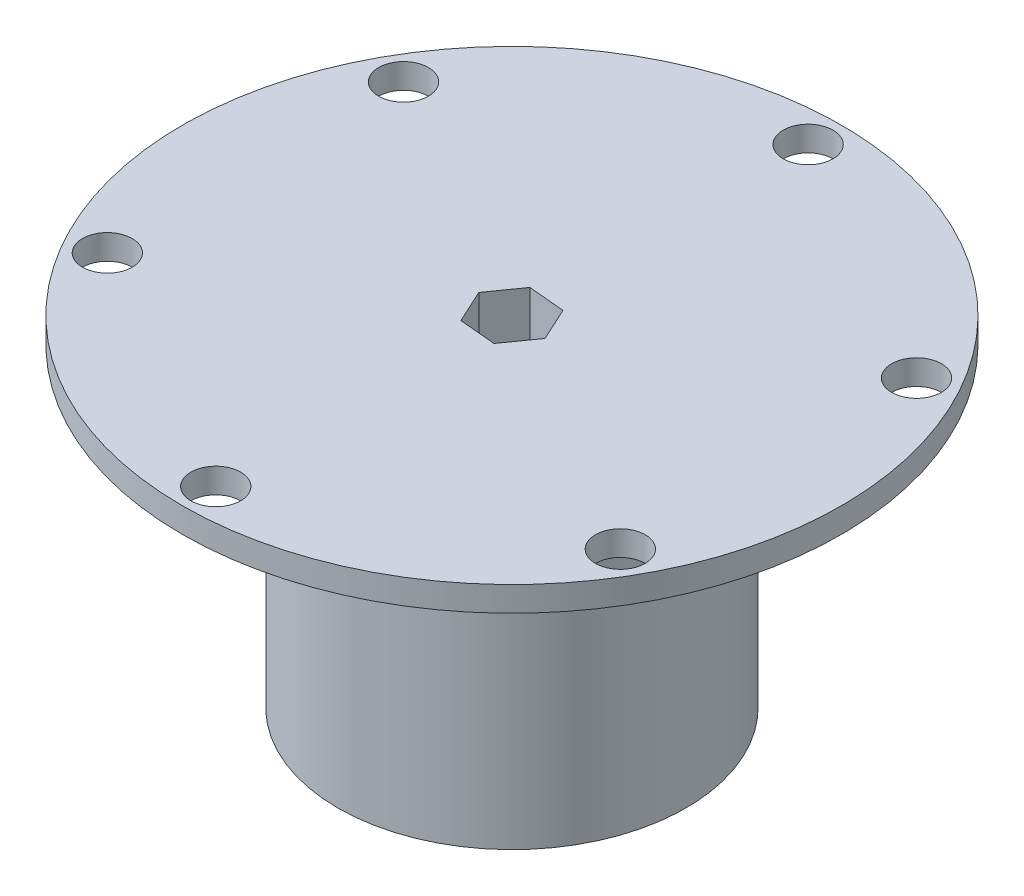
ISO-10303-21;
HEADER;
FILE_DESCRIPTION(('STEP AP214'),'2;1');
FILE_NAME('part.step','',(''),(''),'','','');
FILE_SCHEMA(('AUTOMOTIVE_DESIGN { 1 0 10303 214 1 1 1 1 }'));
ENDSEC;
DATA;
#1=APPLICATION_CONTEXT('core data for automotive mechanical design processes');
#2=APPLICATION_PROTOCOL_DEFINITION('international standard','automotive_design',2000,#1);
#3=PRODUCT_CONTEXT('',#1,'mechanical');
#4=PRODUCT('Part','Part','',(#3));
#5=PRODUCT_RELATED_PRODUCT_CATEGORY('part','',(#4));
#6=PRODUCT_DEFINITION_FORMATION('','',#4);
#7=PRODUCT_DEFINITION_CONTEXT('part definition',#1,'design');
#8=PRODUCT_DEFINITION('design','',#6,#7);
#9=PRODUCT_DEFINITION_SHAPE('','',#8);
#10=(LENGTH_UNIT() NAMED_UNIT(*) SI_UNIT(.MILLI.,.METRE.));
#11=(NAMED_UNIT(*) PLANE_ANGLE_UNIT() SI_UNIT($,.RADIAN.));
#12=(NAMED_UNIT(*) SI_UNIT($,.STERADIAN.) SOLID_ANGLE_UNIT());
#13=UNCERTAINTY_MEASURE_WITH_UNIT(LENGTH_MEASURE(1.E-05),#10,'distance_accuracy_value','');
#14=(GEOMETRIC_REPRESENTATION_CONTEXT(3) GLOBAL_UNCERTAINTY_ASSIGNED_CONTEXT((#13)) GLOBAL_UNIT_ASSIGNED_CONTEXT((#10,
#11,#12)) REPRESENTATION_CONTEXT('',''));
#15=CARTESIAN_POINT('',(0.,0.,0.));
#16=DIRECTION('',(0.,0.,1.));
#17=DIRECTION('',(1.,0.,0.));
#18=AXIS2_PLACEMENT_3D('',#15,#16,#17);
#19=CARTESIAN_POINT('',(0.,25.3,0.));
#20=DIRECTION('',(0.,-1.,0.));
#21=DIRECTION('',(0.,0.,-1.));
#22=AXIS2_PLACEMENT_3D('',#19,#20,#21);
#23=CYLINDRICAL_SURFACE('',#22,14.);
#24=CARTESIAN_POINT('',(0.,25.3,0.));
#25=DIRECTION('',(0.,1.,0.));
#26=DIRECTION('',(0.,0.,1.));
#27=AXIS2_PLACEMENT_3D('',#24,#25,#26);
#28=CIRCLE('',#27,14.);
#29=CARTESIAN_POINT('',(0.,25.3,14.));
#30=VERTEX_POINT('',#29);
#31=EDGE_CURVE('E11',#30,#30,#28,.T.);
#32=ORIENTED_EDGE('',*,*,#31,.F.);
#33=EDGE_LOOP('',(#32));
#34=FACE_BOUND('',#33,.T.);
#35=CARTESIAN_POINT('',(0.,0.,0.));
#36=DIRECTION('',(0.,1.,0.));
#37=DIRECTION('',(0.,0.,1.));
#38=AXIS2_PLACEMENT_3D('',#35,#36,#37);
#39=CIRCLE('',#38,14.);
#40=CARTESIAN_POINT('',(0.,0.,14.));
#41=VERTEX_POINT('',#40);
#42=EDGE_CURVE('E40',#41,#41,#39,.T.);
#43=ORIENTED_EDGE('',*,*,#42,.T.);
#44=EDGE_LOOP('',(#43));
#45=FACE_BOUND('',#44,.T.);
#46=ADVANCED_FACE('F32',(#34,#45),#23,.T.);
#47=CARTESIAN_POINT('',(0.,0.,0.));
#48=DIRECTION('',(0.,1.,0.));
#49=DIRECTION('',(0.,0.,1.));
#50=AXIS2_PLACEMENT_3D('',#47,#48,#49);
#51=PLANE('',#50);
#52=DIRECTION('',(0.419265008460597,0.,0.907863895460402));
#53=VECTOR('',#52,1.);
#54=CARTESIAN_POINT('',(-2.31505293342402,0.,1.06912577157452));
#55=LINE('',#54,#53);
#56=CARTESIAN_POINT('',(-2.93231298544014,0.,-0.267470662726072));
#57=VERTEX_POINT('',#56);
#58=CARTESIAN_POINT('',(-1.69779288140791,0.,2.40572220587511));
#59=VERTEX_POINT('',#58);
#60=EDGE_CURVE('E135',#57,#59,#55,.T.);
#61=ORIENTED_EDGE('',*,*,#60,.T.);
#62=DIRECTION('',(0.995865700877706,0.,0.0908377994854267));
#63=VECTOR('',#62,1.);
#64=CARTESIAN_POINT('',(-0.231636388687838,0.,2.53945753723815));
#65=LINE('',#64,#63);
#66=CARTESIAN_POINT('',(1.23452010403223,0.,2.67319286860119));
#67=VERTEX_POINT('',#66);
#68=EDGE_CURVE('E138',#59,#67,#65,.T.);
#69=ORIENTED_EDGE('',*,*,#68,.T.);
#70=DIRECTION('',(0.57660069241711,0.,-0.817026095974976));
#71=VECTOR('',#70,1.);
#72=CARTESIAN_POINT('',(2.08341654473619,0.,1.47033176566363));
#73=LINE('',#72,#71);
#74=CARTESIAN_POINT('',(2.93231298544014,0.,0.267470662726071));
#75=VERTEX_POINT('',#74);
#76=EDGE_CURVE('E126',#67,#75,#73,.T.);
#77=ORIENTED_EDGE('',*,*,#76,.T.);
#78=DIRECTION('',(-0.419265008460597,0.,-0.907863895460402));
#79=VECTOR('',#78,1.);
#80=CARTESIAN_POINT('',(2.31505293342402,0.,-1.06912577157452));
#81=LINE('',#80,#79);
#82=CARTESIAN_POINT('',(1.69779288140791,0.,-2.40572220587512));
#83=VERTEX_POINT('',#82);
#84=EDGE_CURVE('E92',#75,#83,#81,.T.);
#85=ORIENTED_EDGE('',*,*,#84,.T.);
#86=DIRECTION('',(-0.995865700877706,0.,-0.0908377994854266));
#87=VECTOR('',#86,1.);
#88=CARTESIAN_POINT('',(0.231636388687838,0.,-2.53945753723815));
#89=LINE('',#88,#87);
#90=CARTESIAN_POINT('',(-1.23452010403223,0.,-2.67319286860119));
#91=VERTEX_POINT('',#90);
#92=EDGE_CURVE('E129',#83,#91,#89,.T.);
#93=ORIENTED_EDGE('',*,*,#92,.T.);
#94=DIRECTION('',(-0.57660069241711,0.,0.817026095974976));
#95=VECTOR('',#94,1.);
#96=CARTESIAN_POINT('',(-2.08341654473619,0.,-1.47033176566363));
#97=LINE('',#96,#95);
#98=EDGE_CURVE('E132',#91,#57,#97,.T.);
#99=ORIENTED_EDGE('',*,*,#98,.T.);
#100=EDGE_LOOP('',(#61,#69,#77,#85,#93,#99));
#101=FACE_BOUND('',#100,.T.);
#102=ORIENTED_EDGE('',*,*,#42,.F.);
#103=EDGE_LOOP('',(#102));
#104=FACE_BOUND('',#103,.T.);
#105=ADVANCED_FACE('F186',(#101,#104),#51,.F.);
#106=CARTESIAN_POINT('',(0.,27.3,0.));
#107=DIRECTION('',(0.,-1.,0.));
#108=DIRECTION('',(0.,0.,-1.));
#109=AXIS2_PLACEMENT_3D('',#106,#107,#108);
#110=CYLINDRICAL_SURFACE('',#109,26.5);
#111=CARTESIAN_POINT('',(0.,27.3,0.));
#112=DIRECTION('',(0.,1.,0.));
#113=DIRECTION('',(0.,0.,1.));
#114=AXIS2_PLACEMENT_3D('',#111,#112,#113);
#115=CIRCLE('',#114,26.5);
#116=CARTESIAN_POINT('',(0.,27.3,26.5));
#117=VERTEX_POINT('',#116);
#118=EDGE_CURVE('E142',#117,#117,#115,.T.);
#119=ORIENTED_EDGE('',*,*,#118,.F.);
#120=EDGE_LOOP('',(#119));
#121=FACE_BOUND('',#120,.T.);
#122=CARTESIAN_POINT('',(0.,25.3,0.));
#123=DIRECTION('',(0.,1.,0.));
#124=DIRECTION('',(0.,0.,1.));
#125=AXIS2_PLACEMENT_3D('',#122,#123,#124);
#126=CIRCLE('',#125,26.5);
#127=CARTESIAN_POINT('',(0.,25.3,26.5));
#128=VERTEX_POINT('',#127);
#129=EDGE_CURVE('E141',#128,#128,#126,.T.);
#130=ORIENTED_EDGE('',*,*,#129,.T.);
#131=EDGE_LOOP('',(#130));
#132=FACE_BOUND('',#131,.T.);
#133=ADVANCED_FACE('F191',(#121,#132),#110,.T.);
#134=CARTESIAN_POINT('',(0.,27.3,0.));
#135=DIRECTION('',(0.,1.,0.));
#136=DIRECTION('',(0.,0.,1.));
#137=AXIS2_PLACEMENT_3D('',#134,#135,#136);
#138=PLANE('',#137);
#139=CARTESIAN_POINT('',(-20.6243949911259,27.3,-11.9074999999991));
#140=DIRECTION('',(0.,1.,0.));
#141=DIRECTION('',(0.,0.,1.));
#142=AXIS2_PLACEMENT_3D('',#139,#140,#141);
#143=CIRCLE('',#142,2.00000000000102);
#144=CARTESIAN_POINT('',(-20.6243949911259,27.3,-9.90749999999809));
#145=VERTEX_POINT('',#144);
#146=EDGE_CURVE('E238',#145,#145,#143,.T.);
#147=ORIENTED_EDGE('',*,*,#146,.F.);
#148=EDGE_LOOP('',(#147));
#149=FACE_BOUND('',#148,.T.);
#150=CARTESIAN_POINT('',(-20.6243949911249,27.3,11.9075000000009));
#151=DIRECTION('',(0.,1.,0.));
#152=DIRECTION('',(0.,0.,1.));
#153=AXIS2_PLACEMENT_3D('',#150,#151,#152);
#154=CIRCLE('',#153,2.00000000000193);
#155=CARTESIAN_POINT('',(-20.6243949911249,27.3,13.9075000000028));
#156=VERTEX_POINT('',#155);
#157=EDGE_CURVE('E240',#156,#156,#154,.T.);
#158=ORIENTED_EDGE('',*,*,#157,.F.);
#159=EDGE_LOOP('',(#158));
#160=FACE_BOUND('',#159,.T.);
#161=CARTESIAN_POINT('',(2.02475603755088E-12,27.3,23.815));
#162=DIRECTION('',(0.,1.,0.));
#163=DIRECTION('',(0.,0.,1.));
#164=AXIS2_PLACEMENT_3D('',#161,#162,#163);
#165=CIRCLE('',#164,2.0000000000021);
#166=CARTESIAN_POINT('',(2.02475603755088E-12,27.3,25.8150000000021));
#167=VERTEX_POINT('',#166);
#168=EDGE_CURVE('E243',#167,#167,#165,.T.);
#169=ORIENTED_EDGE('',*,*,#168,.F.);
#170=EDGE_LOOP('',(#169));
#171=FACE_BOUND('',#170,.T.);
#172=CARTESIAN_POINT('',(20.6243949911279,27.3,11.9074999999991));
#173=DIRECTION('',(0.,1.,0.));
#174=DIRECTION('',(0.,0.,1.));
#175=AXIS2_PLACEMENT_3D('',#172,#173,#174);
#176=CIRCLE('',#175,2.00000000000131);
#177=CARTESIAN_POINT('',(20.6243949911279,27.3,13.9075000000004));
#178=VERTEX_POINT('',#177);
#179=EDGE_CURVE('E246',#178,#178,#176,.T.);
#180=ORIENTED_EDGE('',*,*,#179,.F.);
#181=EDGE_LOOP('',(#180));
#182=FACE_BOUND('',#181,.T.);
#183=CARTESIAN_POINT('',(20.6243949911269,27.3,-11.9075000000009));
#184=DIRECTION('',(0.,1.,0.));
#185=DIRECTION('',(0.,0.,1.));
#186=AXIS2_PLACEMENT_3D('',#183,#184,#185);
#187=CIRCLE('',#186,2.00000000000029);
#188=CARTESIAN_POINT('',(20.6243949911269,27.3,-9.9075000000006));
#189=VERTEX_POINT('',#188);
#190=EDGE_CURVE('E235',#189,#189,#187,.T.);
#191=ORIENTED_EDGE('',*,*,#190,.F.);
#192=EDGE_LOOP('',(#191));
#193=FACE_BOUND('',#192,.T.);
#194=CARTESIAN_POINT('',(0.,27.3,-23.815));
#195=DIRECTION('',(0.,1.,0.));
#196=DIRECTION('',(0.,0.,1.));
#197=AXIS2_PLACEMENT_3D('',#194,#195,#196);
#198=CIRCLE('',#197,2.);
#199=CARTESIAN_POINT('',(0.,27.3,-21.815));
#200=VERTEX_POINT('',#199);
#201=EDGE_CURVE('E233',#200,#200,#198,.T.);
#202=ORIENTED_EDGE('',*,*,#201,.F.);
#203=EDGE_LOOP('',(#202));
#204=FACE_BOUND('',#203,.T.);
#205=DIRECTION('',(0.995865700877706,0.,0.0908377994854267));
#206=VECTOR('',#205,1.);
#207=CARTESIAN_POINT('',(-1.69779288140791,27.3,2.40572220587511));
#208=LINE('',#207,#206);
#209=CARTESIAN_POINT('',(-1.69779288140791,27.3,2.40572220587511));
#210=VERTEX_POINT('',#209);
#211=CARTESIAN_POINT('',(1.23452010403223,27.3,2.67319286860119));
#212=VERTEX_POINT('',#211);
#213=EDGE_CURVE('E56',#210,#212,#208,.T.);
#214=ORIENTED_EDGE('',*,*,#213,.F.);
#215=DIRECTION('',(0.419265008460597,0.,0.907863895460402));
#216=VECTOR('',#215,1.);
#217=CARTESIAN_POINT('',(-2.93231298544014,27.3,-0.267470662726072));
#218=LINE('',#217,#216);
#219=CARTESIAN_POINT('',(-2.93231298544014,27.3,-0.267470662726072));
#220=VERTEX_POINT('',#219);
#221=EDGE_CURVE('E114',#220,#210,#218,.T.);
#222=ORIENTED_EDGE('',*,*,#221,.F.);
#223=DIRECTION('',(-0.57660069241711,0.,0.817026095974976));
#224=VECTOR('',#223,1.);
#225=CARTESIAN_POINT('',(-1.23452010403223,27.3,-2.67319286860119));
#226=LINE('',#225,#224);
#227=CARTESIAN_POINT('',(-1.23452010403223,27.3,-2.67319286860119));
#228=VERTEX_POINT('',#227);
#229=EDGE_CURVE('E108',#228,#220,#226,.T.);
#230=ORIENTED_EDGE('',*,*,#229,.F.);
#231=DIRECTION('',(-0.995865700877707,0.,-0.0908377994854266));
#232=VECTOR('',#231,1.);
#233=CARTESIAN_POINT('',(1.69779288140791,27.3,-2.40572220587512));
#234=LINE('',#233,#232);
#235=CARTESIAN_POINT('',(1.69779288140791,27.3,-2.40572220587512));
#236=VERTEX_POINT('',#235);
#237=EDGE_CURVE('E106',#236,#228,#234,.T.);
#238=ORIENTED_EDGE('',*,*,#237,.F.);
#239=DIRECTION('',(-0.419265008460597,0.,-0.907863895460402));
#240=VECTOR('',#239,1.);
#241=CARTESIAN_POINT('',(2.93231298544014,27.3,0.267470662726071));
#242=LINE('',#241,#240);
#243=CARTESIAN_POINT('',(2.93231298544014,27.3,0.267470662726071));
#244=VERTEX_POINT('',#243);
#245=EDGE_CURVE('E89',#244,#236,#242,.T.);
#246=ORIENTED_EDGE('',*,*,#245,.F.);
#247=DIRECTION('',(0.57660069241711,0.,-0.817026095974976));
#248=VECTOR('',#247,1.);
#249=CARTESIAN_POINT('',(1.23452010403223,27.3,2.67319286860119));
#250=LINE('',#249,#248);
#251=EDGE_CURVE('E98',#212,#244,#250,.T.);
#252=ORIENTED_EDGE('',*,*,#251,.F.);
#253=EDGE_LOOP('',(#214,#222,#230,#238,#246,#252));
#254=FACE_BOUND('',#253,.T.);
#255=ORIENTED_EDGE('',*,*,#118,.T.);
#256=EDGE_LOOP('',(#255));
#257=FACE_BOUND('',#256,.T.);
#258=ADVANCED_FACE('F102',(#149,#160,#171,#182,#193,#204,#254,#257),#138,.T.);
#259=CARTESIAN_POINT('',(0.,25.3,0.));
#260=DIRECTION('',(0.,1.,0.));
#261=DIRECTION('',(0.,0.,1.));
#262=AXIS2_PLACEMENT_3D('',#259,#260,#261);
#263=PLANE('',#262);
#264=CARTESIAN_POINT('',(-20.6243949911259,25.3,-11.9074999999991));
#265=DIRECTION('',(0.,1.,0.));
#266=DIRECTION('',(0.,0.,1.));
#267=AXIS2_PLACEMENT_3D('',#264,#265,#266);
#268=CIRCLE('',#267,2.00000000000102);
#269=CARTESIAN_POINT('',(-20.6243949911259,25.3,-9.90749999999809));
#270=VERTEX_POINT('',#269);
#271=EDGE_CURVE('E35',#270,#270,#268,.T.);
#272=ORIENTED_EDGE('',*,*,#271,.T.);
#273=EDGE_LOOP('',(#272));
#274=FACE_BOUND('',#273,.T.);
#275=CARTESIAN_POINT('',(-20.6243949911249,25.3,11.9075000000009));
#276=DIRECTION('',(0.,1.,0.));
#277=DIRECTION('',(0.,0.,1.));
#278=AXIS2_PLACEMENT_3D('',#275,#276,#277);
#279=CIRCLE('',#278,2.00000000000193);
#280=CARTESIAN_POINT('',(-20.6243949911249,25.3,13.9075000000028));
#281=VERTEX_POINT('',#280);
#282=EDGE_CURVE('E159',#281,#281,#279,.T.);
#283=ORIENTED_EDGE('',*,*,#282,.T.);
#284=EDGE_LOOP('',(#283));
#285=FACE_BOUND('',#284,.T.);
#286=CARTESIAN_POINT('',(2.02475603755088E-12,25.3,23.815));
#287=DIRECTION('',(0.,1.,0.));
#288=DIRECTION('',(0.,0.,1.));
#289=AXIS2_PLACEMENT_3D('',#286,#287,#288);
#290=CIRCLE('',#289,2.0000000000021);
#291=CARTESIAN_POINT('',(2.02475603755088E-12,25.3,25.8150000000021));
#292=VERTEX_POINT('',#291);
#293=EDGE_CURVE('E157',#292,#292,#290,.T.);
#294=ORIENTED_EDGE('',*,*,#293,.T.);
#295=EDGE_LOOP('',(#294));
#296=FACE_BOUND('',#295,.T.);
#297=CARTESIAN_POINT('',(20.6243949911279,25.3,11.9074999999991));
#298=DIRECTION('',(0.,1.,0.));
#299=DIRECTION('',(0.,0.,1.));
#300=AXIS2_PLACEMENT_3D('',#297,#298,#299);
#301=CIRCLE('',#300,2.00000000000131);
#302=CARTESIAN_POINT('',(20.6243949911279,25.3,13.9075000000004));
#303=VERTEX_POINT('',#302);
#304=EDGE_CURVE('E154',#303,#303,#301,.T.);
#305=ORIENTED_EDGE('',*,*,#304,.T.);
#306=EDGE_LOOP('',(#305));
#307=FACE_BOUND('',#306,.T.);
#308=CARTESIAN_POINT('',(20.6243949911269,25.3,-11.9075000000009));
#309=DIRECTION('',(0.,1.,0.));
#310=DIRECTION('',(0.,0.,1.));
#311=AXIS2_PLACEMENT_3D('',#308,#309,#310);
#312=CIRCLE('',#311,2.00000000000029);
#313=CARTESIAN_POINT('',(20.6243949911269,25.3,-9.9075000000006));
#314=VERTEX_POINT('',#313);
#315=EDGE_CURVE('E151',#314,#314,#312,.T.);
#316=ORIENTED_EDGE('',*,*,#315,.T.);
#317=EDGE_LOOP('',(#316));
#318=FACE_BOUND('',#317,.T.);
#319=CARTESIAN_POINT('',(0.,25.3,-23.815));
#320=DIRECTION('',(0.,1.,0.));
#321=DIRECTION('',(0.,0.,1.));
#322=AXIS2_PLACEMENT_3D('',#319,#320,#321);
#323=CIRCLE('',#322,2.);
#324=CARTESIAN_POINT('',(0.,25.3,-21.815));
#325=VERTEX_POINT('',#324);
#326=EDGE_CURVE('E119',#325,#325,#323,.T.);
#327=ORIENTED_EDGE('',*,*,#326,.T.);
#328=EDGE_LOOP('',(#327));
#329=FACE_BOUND('',#328,.T.);
#330=ORIENTED_EDGE('',*,*,#31,.T.);
#331=EDGE_LOOP('',(#330));
#332=FACE_BOUND('',#331,.T.);
#333=ORIENTED_EDGE('',*,*,#129,.F.);
#334=EDGE_LOOP('',(#333));
#335=FACE_BOUND('',#334,.T.);
#336=ADVANCED_FACE('F166',(#274,#285,#296,#307,#318,#329,#332,#335),#263,.F.);
#337=CARTESIAN_POINT('',(0.,-4.7,-23.815));
#338=DIRECTION('',(0.,1.,0.));
#339=DIRECTION('',(0.,0.,1.));
#340=AXIS2_PLACEMENT_3D('',#337,#338,#339);
#341=CYLINDRICAL_SURFACE('',#340,2.);
#342=ORIENTED_EDGE('',*,*,#201,.T.);
#343=EDGE_LOOP('',(#342));
#344=FACE_BOUND('',#343,.T.);
#345=ORIENTED_EDGE('',*,*,#326,.F.);
#346=EDGE_LOOP('',(#345));
#347=FACE_BOUND('',#346,.T.);
#348=ADVANCED_FACE('F200',(#344,#347),#341,.F.);
#349=CARTESIAN_POINT('',(20.6243949911269,-4.7,-11.9075000000009));
#350=DIRECTION('',(0.,1.,0.));
#351=DIRECTION('',(0.,0.,1.));
#352=AXIS2_PLACEMENT_3D('',#349,#350,#351);
#353=CYLINDRICAL_SURFACE('',#352,2.00000000000029);
#354=ORIENTED_EDGE('',*,*,#190,.T.);
#355=EDGE_LOOP('',(#354));
#356=FACE_BOUND('',#355,.T.);
#357=ORIENTED_EDGE('',*,*,#315,.F.);
#358=EDGE_LOOP('',(#357));
#359=FACE_BOUND('',#358,.T.);
#360=ADVANCED_FACE('F252',(#356,#359),#353,.F.);
#361=CARTESIAN_POINT('',(20.6243949911279,-4.7,11.9074999999991));
#362=DIRECTION('',(0.,1.,0.));
#363=DIRECTION('',(0.,0.,1.));
#364=AXIS2_PLACEMENT_3D('',#361,#362,#363);
#365=CYLINDRICAL_SURFACE('',#364,2.00000000000131);
#366=ORIENTED_EDGE('',*,*,#179,.T.);
#367=EDGE_LOOP('',(#366));
#368=FACE_BOUND('',#367,.T.);
#369=ORIENTED_EDGE('',*,*,#304,.F.);
#370=EDGE_LOOP('',(#369));
#371=FACE_BOUND('',#370,.T.);
#372=ADVANCED_FACE('F266',(#368,#371),#365,.F.);
#373=CARTESIAN_POINT('',(2.02475603755088E-12,-4.7,23.815));
#374=DIRECTION('',(0.,1.,0.));
#375=DIRECTION('',(0.,0.,1.));
#376=AXIS2_PLACEMENT_3D('',#373,#374,#375);
#377=CYLINDRICAL_SURFACE('',#376,2.0000000000021);
#378=ORIENTED_EDGE('',*,*,#168,.T.);
#379=EDGE_LOOP('',(#378));
#380=FACE_BOUND('',#379,.T.);
#381=ORIENTED_EDGE('',*,*,#293,.F.);
#382=EDGE_LOOP('',(#381));
#383=FACE_BOUND('',#382,.T.);
#384=ADVANCED_FACE('F180',(#380,#383),#377,.F.);
#385=CARTESIAN_POINT('',(-20.6243949911249,-4.7,11.9075000000009));
#386=DIRECTION('',(0.,1.,0.));
#387=DIRECTION('',(0.,0.,1.));
#388=AXIS2_PLACEMENT_3D('',#385,#386,#387);
#389=CYLINDRICAL_SURFACE('',#388,2.00000000000193);
#390=ORIENTED_EDGE('',*,*,#157,.T.);
#391=EDGE_LOOP('',(#390));
#392=FACE_BOUND('',#391,.T.);
#393=ORIENTED_EDGE('',*,*,#282,.F.);
#394=EDGE_LOOP('',(#393));
#395=FACE_BOUND('',#394,.T.);
#396=ADVANCED_FACE('F171',(#392,#395),#389,.F.);
#397=CARTESIAN_POINT('',(-20.6243949911259,-4.7,-11.9074999999991));
#398=DIRECTION('',(0.,1.,0.));
#399=DIRECTION('',(0.,0.,1.));
#400=AXIS2_PLACEMENT_3D('',#397,#398,#399);
#401=CYLINDRICAL_SURFACE('',#400,2.00000000000102);
#402=ORIENTED_EDGE('',*,*,#146,.T.);
#403=EDGE_LOOP('',(#402));
#404=FACE_BOUND('',#403,.T.);
#405=ORIENTED_EDGE('',*,*,#271,.F.);
#406=EDGE_LOOP('',(#405));
#407=FACE_BOUND('',#406,.T.);
#408=ADVANCED_FACE('F168',(#404,#407),#401,.F.);
#409=CARTESIAN_POINT('',(-1.69779288140791,-4.7,2.40572220587511));
#410=DIRECTION('',(-0.0908377994854267,0.,0.995865700877706));
#411=DIRECTION('',(0.995865700877706,0.,0.0908377994854267));
#412=AXIS2_PLACEMENT_3D('',#409,#410,#411);
#413=PLANE('',#412);
#414=DIRECTION('',(0.,1.,0.));
#415=VECTOR('',#414,1.);
#416=CARTESIAN_POINT('',(-1.69779288140791,-4.7,2.40572220587511));
#417=LINE('',#416,#415);
#418=EDGE_CURVE('E117',#59,#210,#417,.T.);
#419=ORIENTED_EDGE('',*,*,#418,.T.);
#420=ORIENTED_EDGE('',*,*,#213,.T.);
#421=DIRECTION('',(0.,1.,0.));
#422=VECTOR('',#421,1.);
#423=CARTESIAN_POINT('',(1.23452010403223,-4.7,2.67319286860119));
#424=LINE('',#423,#422);
#425=EDGE_CURVE('E95',#67,#212,#424,.T.);
#426=ORIENTED_EDGE('',*,*,#425,.F.);
#427=ORIENTED_EDGE('',*,*,#68,.F.);
#428=EDGE_LOOP('',(#419,#420,#426,#427));
#429=FACE_BOUND('',#428,.T.);
#430=ADVANCED_FACE('F170',(#429),#413,.F.);
#431=CARTESIAN_POINT('',(-2.93231298544014,-4.7,-0.267470662726072));
#432=DIRECTION('',(-0.907863895460402,0.,0.419265008460597));
#433=DIRECTION('',(0.419265008460597,0.,0.907863895460402));
#434=AXIS2_PLACEMENT_3D('',#431,#432,#433);
#435=PLANE('',#434);
#436=DIRECTION('',(0.,1.,0.));
#437=VECTOR('',#436,1.);
#438=CARTESIAN_POINT('',(-2.93231298544014,-4.7,-0.267470662726072));
#439=LINE('',#438,#437);
#440=EDGE_CURVE('E120',#57,#220,#439,.T.);
#441=ORIENTED_EDGE('',*,*,#440,.T.);
#442=ORIENTED_EDGE('',*,*,#221,.T.);
#443=ORIENTED_EDGE('',*,*,#418,.F.);
#444=ORIENTED_EDGE('',*,*,#60,.F.);
#445=EDGE_LOOP('',(#441,#442,#443,#444));
#446=FACE_BOUND('',#445,.T.);
#447=ADVANCED_FACE('F178',(#446),#435,.F.);
#448=CARTESIAN_POINT('',(-1.23452010403223,-4.7,-2.67319286860119));
#449=DIRECTION('',(-0.817026095974975,0.,-0.576600692417109));
#450=DIRECTION('',(-0.57660069241711,0.,0.817026095974976));
#451=AXIS2_PLACEMENT_3D('',#448,#449,#450);
#452=PLANE('',#451);
#453=DIRECTION('',(0.,1.,0.));
#454=VECTOR('',#453,1.);
#455=CARTESIAN_POINT('',(-1.23452010403223,-4.7,-2.67319286860119));
#456=LINE('',#455,#454);
#457=EDGE_CURVE('E122',#91,#228,#456,.T.);
#458=ORIENTED_EDGE('',*,*,#457,.T.);
#459=ORIENTED_EDGE('',*,*,#229,.T.);
#460=ORIENTED_EDGE('',*,*,#440,.F.);
#461=ORIENTED_EDGE('',*,*,#98,.F.);
#462=EDGE_LOOP('',(#458,#459,#460,#461));
#463=FACE_BOUND('',#462,.T.);
#464=ADVANCED_FACE('F221',(#463),#452,.F.);
#465=CARTESIAN_POINT('',(1.69779288140791,-4.7,-2.40572220587512));
#466=DIRECTION('',(0.0908377994854266,0.,-0.995865700877706));
#467=DIRECTION('',(-0.995865700877706,0.,-0.0908377994854266));
#468=AXIS2_PLACEMENT_3D('',#465,#466,#467);
#469=PLANE('',#468);
#470=DIRECTION('',(0.,1.,0.));
#471=VECTOR('',#470,1.);
#472=CARTESIAN_POINT('',(1.69779288140791,-4.7,-2.40572220587512));
#473=LINE('',#472,#471);
#474=EDGE_CURVE('E94',#83,#236,#473,.T.);
#475=ORIENTED_EDGE('',*,*,#474,.T.);
#476=ORIENTED_EDGE('',*,*,#237,.T.);
#477=ORIENTED_EDGE('',*,*,#457,.F.);
#478=ORIENTED_EDGE('',*,*,#92,.F.);
#479=EDGE_LOOP('',(#475,#476,#477,#478));
#480=FACE_BOUND('',#479,.T.);
#481=ADVANCED_FACE('F218',(#480),#469,.F.);
#482=CARTESIAN_POINT('',(2.93231298544014,-4.7,0.267470662726071));
#483=DIRECTION('',(0.907863895460402,0.,-0.419265008460597));
#484=DIRECTION('',(-0.419265008460597,0.,-0.907863895460402));
#485=AXIS2_PLACEMENT_3D('',#482,#483,#484);
#486=PLANE('',#485);
#487=DIRECTION('',(0.,1.,0.));
#488=VECTOR('',#487,1.);
#489=CARTESIAN_POINT('',(2.93231298544014,-4.7,0.267470662726071));
#490=LINE('',#489,#488);
#491=EDGE_CURVE('E48',#75,#244,#490,.T.);
#492=ORIENTED_EDGE('',*,*,#491,.T.);
#493=ORIENTED_EDGE('',*,*,#245,.T.);
#494=ORIENTED_EDGE('',*,*,#474,.F.);
#495=ORIENTED_EDGE('',*,*,#84,.F.);
#496=EDGE_LOOP('',(#492,#493,#494,#495));
#497=FACE_BOUND('',#496,.T.);
#498=ADVANCED_FACE('F86',(#497),#486,.F.);
#499=CARTESIAN_POINT('',(1.23452010403223,-4.7,2.67319286860119));
#500=DIRECTION('',(0.817026095974975,0.,0.576600692417109));
#501=DIRECTION('',(0.57660069241711,0.,-0.817026095974976));
#502=AXIS2_PLACEMENT_3D('',#499,#500,#501);
#503=PLANE('',#502);
#504=ORIENTED_EDGE('',*,*,#425,.T.);
#505=ORIENTED_EDGE('',*,*,#251,.T.);
#506=ORIENTED_EDGE('',*,*,#491,.F.);
#507=ORIENTED_EDGE('',*,*,#76,.F.);
#508=EDGE_LOOP('',(#504,#505,#506,#507));
#509=FACE_BOUND('',#508,.T.);
#510=ADVANCED_FACE('F99',(#509),#503,.F.);
#511=CLOSED_SHELL('',(#46,#105,#133,#258,#336,#348,#360,#372,#384,#396,#408,#430,#447,#464,#481,
#498,#510));
#512=MANIFOLD_SOLID_BREP('B2',#511);
#513=ADVANCED_BREP_SHAPE_REPRESENTATION('',(#18,#512),#14);
#514=SHAPE_DEFINITION_REPRESENTATION(#9,#513);
ENDSEC;
END-ISO-10303-21;
